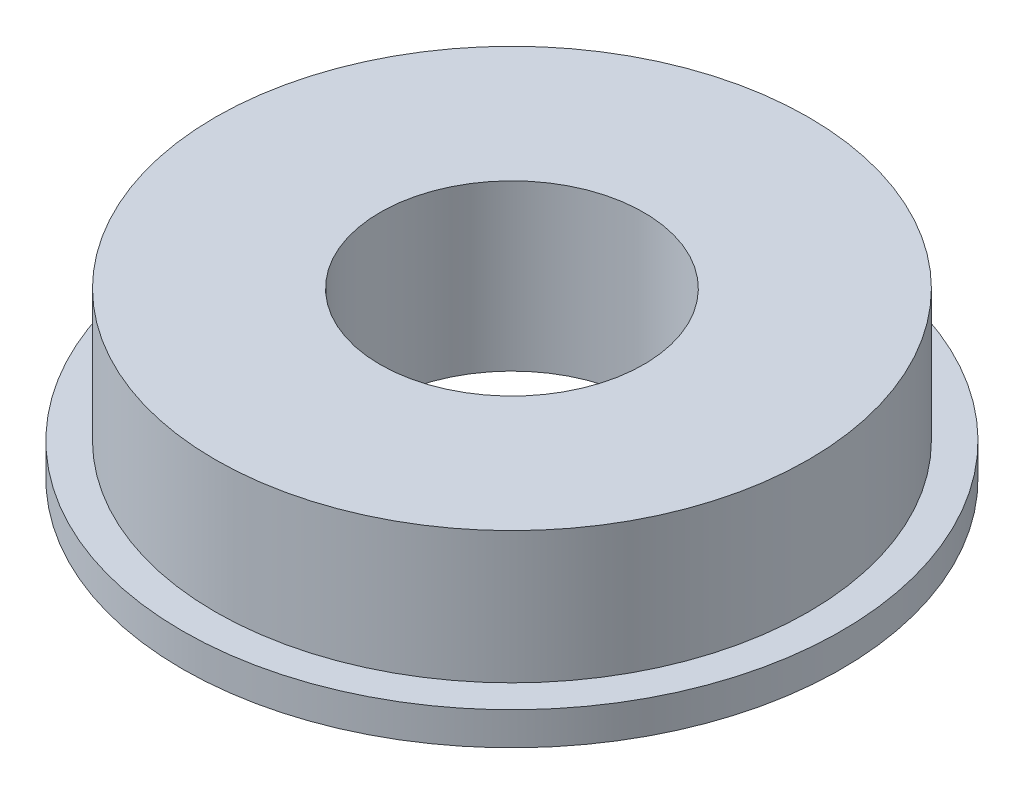
ISO-10303-21;
HEADER;
FILE_DESCRIPTION(('STEP AP214'),'2;1');
FILE_NAME('part.step','',(''),(''),'','','');
FILE_SCHEMA(('AUTOMOTIVE_DESIGN { 1 0 10303 214 1 1 1 1 }'));
ENDSEC;
DATA;
#1=APPLICATION_CONTEXT('core data for automotive mechanical design processes');
#2=APPLICATION_PROTOCOL_DEFINITION('international standard','automotive_design',2000,#1);
#3=PRODUCT_CONTEXT('',#1,'mechanical');
#4=PRODUCT('Part','Part','',(#3));
#5=PRODUCT_RELATED_PRODUCT_CATEGORY('part','',(#4));
#6=PRODUCT_DEFINITION_FORMATION('','',#4);
#7=PRODUCT_DEFINITION_CONTEXT('part definition',#1,'design');
#8=PRODUCT_DEFINITION('design','',#6,#7);
#9=PRODUCT_DEFINITION_SHAPE('','',#8);
#10=(LENGTH_UNIT() NAMED_UNIT(*) SI_UNIT(.MILLI.,.METRE.));
#11=(NAMED_UNIT(*) PLANE_ANGLE_UNIT() SI_UNIT($,.RADIAN.));
#12=(NAMED_UNIT(*) SI_UNIT($,.STERADIAN.) SOLID_ANGLE_UNIT());
#13=UNCERTAINTY_MEASURE_WITH_UNIT(LENGTH_MEASURE(1.E-05),#10,'distance_accuracy_value','');
#14=(GEOMETRIC_REPRESENTATION_CONTEXT(3) GLOBAL_UNCERTAINTY_ASSIGNED_CONTEXT((#13)) GLOBAL_UNIT_ASSIGNED_CONTEXT((#10,
#11,#12)) REPRESENTATION_CONTEXT('',''));
#15=CARTESIAN_POINT('',(0.,0.,0.));
#16=DIRECTION('',(0.,0.,1.));
#17=DIRECTION('',(1.,0.,0.));
#18=AXIS2_PLACEMENT_3D('',#15,#16,#17);
#19=CARTESIAN_POINT('',(0.,1.5875,0.));
#20=DIRECTION('',(0.,-1.,0.));
#21=DIRECTION('',(0.,0.,-1.));
#22=AXIS2_PLACEMENT_3D('',#19,#20,#21);
#23=CYLINDRICAL_SURFACE('',#22,15.875);
#24=CARTESIAN_POINT('',(0.,1.5875,0.));
#25=DIRECTION('',(0.,1.,0.));
#26=DIRECTION('',(0.,0.,1.));
#27=AXIS2_PLACEMENT_3D('',#24,#25,#26);
#28=CIRCLE('',#27,15.875);
#29=CARTESIAN_POINT('',(0.,1.5875,15.875));
#30=VERTEX_POINT('',#29);
#31=EDGE_CURVE('E38',#30,#30,#28,.T.);
#32=ORIENTED_EDGE('',*,*,#31,.F.);
#33=EDGE_LOOP('',(#32));
#34=FACE_BOUND('',#33,.T.);
#35=CARTESIAN_POINT('',(0.,0.,0.));
#36=DIRECTION('',(0.,1.,0.));
#37=DIRECTION('',(0.,0.,1.));
#38=AXIS2_PLACEMENT_3D('',#35,#36,#37);
#39=CIRCLE('',#38,15.875);
#40=CARTESIAN_POINT('',(0.,0.,15.875));
#41=VERTEX_POINT('',#40);
#42=EDGE_CURVE('E34',#41,#41,#39,.T.);
#43=ORIENTED_EDGE('',*,*,#42,.T.);
#44=EDGE_LOOP('',(#43));
#45=FACE_BOUND('',#44,.T.);
#46=ADVANCED_FACE('F31',(#34,#45),#23,.T.);
#47=CARTESIAN_POINT('',(0.,1.5875,0.));
#48=DIRECTION('',(0.,1.,0.));
#49=DIRECTION('',(0.,0.,1.));
#50=AXIS2_PLACEMENT_3D('',#47,#48,#49);
#51=PLANE('',#50);
#52=CARTESIAN_POINT('',(0.,1.5875,0.));
#53=DIRECTION('',(0.,1.,0.));
#54=DIRECTION('',(0.,0.,1.));
#55=AXIS2_PLACEMENT_3D('',#52,#53,#54);
#56=CIRCLE('',#55,14.2875);
#57=CARTESIAN_POINT('',(0.,1.5875,14.2875));
#58=VERTEX_POINT('',#57);
#59=EDGE_CURVE('E10',#58,#58,#56,.T.);
#60=ORIENTED_EDGE('',*,*,#59,.F.);
#61=EDGE_LOOP('',(#60));
#62=FACE_BOUND('',#61,.T.);
#63=ORIENTED_EDGE('',*,*,#31,.T.);
#64=EDGE_LOOP('',(#63));
#65=FACE_BOUND('',#64,.T.);
#66=ADVANCED_FACE('F75',(#62,#65),#51,.T.);
#67=CARTESIAN_POINT('',(0.,0.,0.));
#68=DIRECTION('',(0.,1.,0.));
#69=DIRECTION('',(0.,0.,1.));
#70=AXIS2_PLACEMENT_3D('',#67,#68,#69);
#71=PLANE('',#70);
#72=CARTESIAN_POINT('',(0.,0.,0.));
#73=DIRECTION('',(0.,1.,0.));
#74=DIRECTION('',(0.,0.,1.));
#75=AXIS2_PLACEMENT_3D('',#72,#73,#74);
#76=CIRCLE('',#75,6.35);
#77=CARTESIAN_POINT('',(0.,0.,6.35));
#78=VERTEX_POINT('',#77);
#79=EDGE_CURVE('E47',#78,#78,#76,.T.);
#80=ORIENTED_EDGE('',*,*,#79,.T.);
#81=EDGE_LOOP('',(#80));
#82=FACE_BOUND('',#81,.T.);
#83=ORIENTED_EDGE('',*,*,#42,.F.);
#84=EDGE_LOOP('',(#83));
#85=FACE_BOUND('',#84,.T.);
#86=ADVANCED_FACE('F54',(#82,#85),#71,.F.);
#87=CARTESIAN_POINT('',(0.,7.9375,0.));
#88=DIRECTION('',(0.,-1.,0.));
#89=DIRECTION('',(0.,0.,-1.));
#90=AXIS2_PLACEMENT_3D('',#87,#88,#89);
#91=CYLINDRICAL_SURFACE('',#90,14.2875);
#92=CARTESIAN_POINT('',(0.,7.9375,0.));
#93=DIRECTION('',(0.,1.,0.));
#94=DIRECTION('',(0.,0.,1.));
#95=AXIS2_PLACEMENT_3D('',#92,#93,#94);
#96=CIRCLE('',#95,14.2875);
#97=CARTESIAN_POINT('',(0.,7.9375,14.2875));
#98=VERTEX_POINT('',#97);
#99=EDGE_CURVE('E44',#98,#98,#96,.T.);
#100=ORIENTED_EDGE('',*,*,#99,.F.);
#101=EDGE_LOOP('',(#100));
#102=FACE_BOUND('',#101,.T.);
#103=ORIENTED_EDGE('',*,*,#59,.T.);
#104=EDGE_LOOP('',(#103));
#105=FACE_BOUND('',#104,.T.);
#106=ADVANCED_FACE('F66',(#102,#105),#91,.T.);
#107=CARTESIAN_POINT('',(0.,7.9375,0.));
#108=DIRECTION('',(0.,1.,0.));
#109=DIRECTION('',(0.,0.,1.));
#110=AXIS2_PLACEMENT_3D('',#107,#108,#109);
#111=PLANE('',#110);
#112=CARTESIAN_POINT('',(0.,7.9375,0.));
#113=DIRECTION('',(0.,1.,0.));
#114=DIRECTION('',(0.,0.,1.));
#115=AXIS2_PLACEMENT_3D('',#112,#113,#114);
#116=CIRCLE('',#115,6.35);
#117=CARTESIAN_POINT('',(0.,7.9375,6.35));
#118=VERTEX_POINT('',#117);
#119=EDGE_CURVE('E48',#118,#118,#116,.T.);
#120=ORIENTED_EDGE('',*,*,#119,.F.);
#121=EDGE_LOOP('',(#120));
#122=FACE_BOUND('',#121,.T.);
#123=ORIENTED_EDGE('',*,*,#99,.T.);
#124=EDGE_LOOP('',(#123));
#125=FACE_BOUND('',#124,.T.);
#126=ADVANCED_FACE('F60',(#122,#125),#111,.T.);
#127=CARTESIAN_POINT('',(0.,0.,0.));
#128=DIRECTION('',(0.,1.,0.));
#129=DIRECTION('',(0.,0.,1.));
#130=AXIS2_PLACEMENT_3D('',#127,#128,#129);
#131=CYLINDRICAL_SURFACE('',#130,6.35);
#132=ORIENTED_EDGE('',*,*,#79,.F.);
#133=EDGE_LOOP('',(#132));
#134=FACE_BOUND('',#133,.T.);
#135=ORIENTED_EDGE('',*,*,#119,.T.);
#136=EDGE_LOOP('',(#135));
#137=FACE_BOUND('',#136,.T.);
#138=ADVANCED_FACE('F57',(#134,#137),#131,.F.);
#139=CLOSED_SHELL('',(#46,#66,#86,#106,#126,#138));
#140=MANIFOLD_SOLID_BREP('B2',#139);
#141=ADVANCED_BREP_SHAPE_REPRESENTATION('',(#18,#140),#14);
#142=SHAPE_DEFINITION_REPRESENTATION(#9,#141);
ENDSEC;
END-ISO-10303-21;
